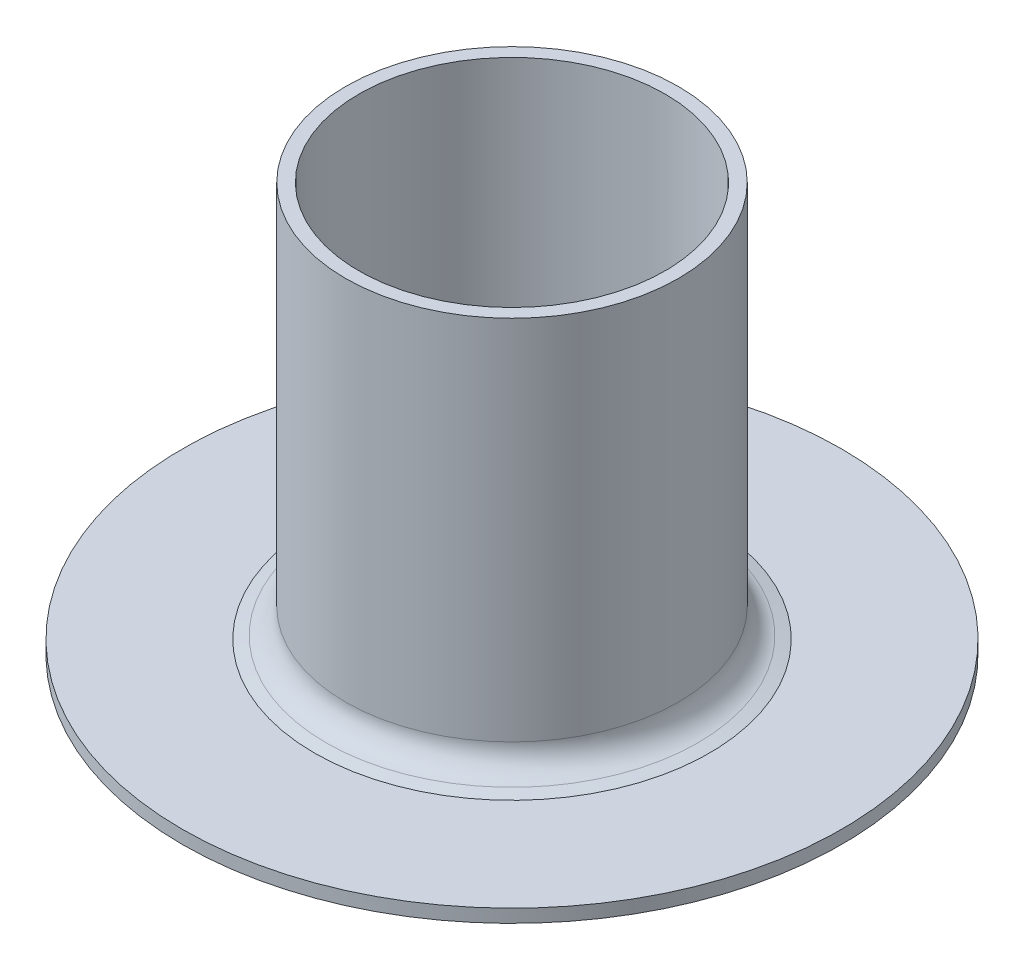
ISO-10303-21;
HEADER;
FILE_DESCRIPTION(('STEP AP214'),'2;1');
FILE_NAME('part.step','',(''),(''),'','','');
FILE_SCHEMA(('AUTOMOTIVE_DESIGN { 1 0 10303 214 1 1 1 1 }'));
ENDSEC;
DATA;
#1=APPLICATION_CONTEXT('core data for automotive mechanical design processes');
#2=APPLICATION_PROTOCOL_DEFINITION('international standard','automotive_design',2000,#1);
#3=PRODUCT_CONTEXT('',#1,'mechanical');
#4=PRODUCT('Part','Part','',(#3));
#5=PRODUCT_RELATED_PRODUCT_CATEGORY('part','',(#4));
#6=PRODUCT_DEFINITION_FORMATION('','',#4);
#7=PRODUCT_DEFINITION_CONTEXT('part definition',#1,'design');
#8=PRODUCT_DEFINITION('design','',#6,#7);
#9=PRODUCT_DEFINITION_SHAPE('','',#8);
#10=(LENGTH_UNIT() NAMED_UNIT(*) SI_UNIT(.MILLI.,.METRE.));
#11=(NAMED_UNIT(*) PLANE_ANGLE_UNIT() SI_UNIT($,.RADIAN.));
#12=(NAMED_UNIT(*) SI_UNIT($,.STERADIAN.) SOLID_ANGLE_UNIT());
#13=UNCERTAINTY_MEASURE_WITH_UNIT(LENGTH_MEASURE(1.E-05),#10,'distance_accuracy_value','');
#14=(GEOMETRIC_REPRESENTATION_CONTEXT(3) GLOBAL_UNCERTAINTY_ASSIGNED_CONTEXT((#13)) GLOBAL_UNIT_ASSIGNED_CONTEXT((#10,
#11,#12)) REPRESENTATION_CONTEXT('',''));
#15=CARTESIAN_POINT('',(0.,0.,0.));
#16=DIRECTION('',(0.,0.,1.));
#17=DIRECTION('',(1.,0.,0.));
#18=AXIS2_PLACEMENT_3D('',#15,#16,#17);
#19=CARTESIAN_POINT('',(29.5148,-2.54,0.));
#20=DIRECTION('',(0.,-1.,0.));
#21=DIRECTION('',(0.,0.,-1.));
#22=AXIS2_PLACEMENT_3D('',#19,#20,#21);
#23=PLANE('',#22);
#24=CARTESIAN_POINT('',(0.,-2.54,0.));
#25=DIRECTION('',(0.,-1.,0.));
#26=DIRECTION('',(0.,0.,-1.));
#27=AXIS2_PLACEMENT_3D('',#24,#25,#26);
#28=CIRCLE('',#27,63.5);
#29=CARTESIAN_POINT('',(0.,-2.54,-63.5));
#30=VERTEX_POINT('',#29);
#31=EDGE_CURVE('E10',#30,#30,#28,.T.);
#32=ORIENTED_EDGE('',*,*,#31,.T.);
#33=EDGE_LOOP('',(#32));
#34=FACE_BOUND('',#33,.T.);
#35=CARTESIAN_POINT('',(0.,-2.54,0.));
#36=DIRECTION('',(0.,-1.,0.));
#37=DIRECTION('',(0.,0.,-1.));
#38=AXIS2_PLACEMENT_3D('',#35,#36,#37);
#39=CIRCLE('',#38,29.5148);
#40=CARTESIAN_POINT('',(0.,-2.54,-29.5148));
#41=VERTEX_POINT('',#40);
#42=EDGE_CURVE('E76',#41,#41,#39,.T.);
#43=ORIENTED_EDGE('',*,*,#42,.F.);
#44=EDGE_LOOP('',(#43));
#45=FACE_BOUND('',#44,.T.);
#46=ADVANCED_FACE('F41',(#34,#45),#23,.T.);
#47=CARTESIAN_POINT('',(0.,0.,0.));
#48=DIRECTION('',(0.,-1.,0.));
#49=DIRECTION('',(0.,0.,-1.));
#50=AXIS2_PLACEMENT_3D('',#47,#48,#49);
#51=CYLINDRICAL_SURFACE('',#50,63.5);
#52=CARTESIAN_POINT('',(0.,0.,0.));
#53=DIRECTION('',(0.,-1.,0.));
#54=DIRECTION('',(0.,0.,-1.));
#55=AXIS2_PLACEMENT_3D('',#52,#53,#54);
#56=CIRCLE('',#55,63.5);
#57=CARTESIAN_POINT('',(0.,0.,-63.5));
#58=VERTEX_POINT('',#57);
#59=EDGE_CURVE('E48',#58,#58,#56,.T.);
#60=ORIENTED_EDGE('',*,*,#59,.T.);
#61=EDGE_LOOP('',(#60));
#62=FACE_BOUND('',#61,.T.);
#63=ORIENTED_EDGE('',*,*,#31,.F.);
#64=EDGE_LOOP('',(#63));
#65=FACE_BOUND('',#64,.T.);
#66=ADVANCED_FACE('F85',(#62,#65),#51,.T.);
#67=CARTESIAN_POINT('',(63.5,0.,0.));
#68=DIRECTION('',(0.,1.,0.));
#69=DIRECTION('',(0.,0.,1.));
#70=AXIS2_PLACEMENT_3D('',#67,#68,#69);
#71=PLANE('',#70);
#72=CARTESIAN_POINT('',(0.,0.,0.));
#73=DIRECTION('',(0.,-1.,0.));
#74=DIRECTION('',(0.,0.,-1.));
#75=AXIS2_PLACEMENT_3D('',#72,#73,#74);
#76=CIRCLE('',#75,38.0492);
#77=CARTESIAN_POINT('',(0.,0.,-38.0492));
#78=VERTEX_POINT('',#77);
#79=EDGE_CURVE('E53',#78,#78,#76,.T.);
#80=ORIENTED_EDGE('',*,*,#79,.T.);
#81=EDGE_LOOP('',(#80));
#82=FACE_BOUND('',#81,.T.);
#83=ORIENTED_EDGE('',*,*,#59,.F.);
#84=EDGE_LOOP('',(#83));
#85=FACE_BOUND('',#84,.T.);
#86=ADVANCED_FACE('F89',(#82,#85),#71,.T.);
#87=CARTESIAN_POINT('',(0.,0.,0.));
#88=DIRECTION('',(0.,-1.,0.));
#89=DIRECTION('',(0.,0.,-1.));
#90=AXIS2_PLACEMENT_3D('',#87,#88,#89);
#91=CONICAL_SURFACE('',#90,38.0492,1.30899693899576);
#92=CARTESIAN_POINT('',(0.,0.597312540493741,0.));
#93=DIRECTION('',(0.,-1.,0.));
#94=DIRECTION('',(0.,0.,-1.));
#95=AXIS2_PLACEMENT_3D('',#92,#93,#94);
#96=CIRCLE('',#95,35.8199992508792);
#97=CARTESIAN_POINT('',(0.,0.597312540493741,-35.8199992508792));
#98=VERTEX_POINT('',#97);
#99=EDGE_CURVE('E58',#98,#98,#96,.T.);
#100=ORIENTED_EDGE('',*,*,#99,.T.);
#101=EDGE_LOOP('',(#100));
#102=FACE_BOUND('',#101,.T.);
#103=ORIENTED_EDGE('',*,*,#79,.F.);
#104=EDGE_LOOP('',(#103));
#105=FACE_BOUND('',#104,.T.);
#106=ADVANCED_FACE('F93',(#102,#105),#91,.T.);
#107=CARTESIAN_POINT('',(0.,5.50421573804222,0.));
#108=DIRECTION('',(0.,-1.,0.));
#109=DIRECTION('',(0.,0.,-1.));
#110=AXIS2_PLACEMENT_3D('',#107,#108,#109);
#111=TOROIDAL_SURFACE('',#110,37.1348,5.08);
#112=CARTESIAN_POINT('',(0.,5.50421573804222,0.));
#113=DIRECTION('',(0.,-1.,0.));
#114=DIRECTION('',(0.,0.,-1.));
#115=AXIS2_PLACEMENT_3D('',#112,#113,#114);
#116=CIRCLE('',#115,32.0548);
#117=CARTESIAN_POINT('',(0.,5.50421573804222,-32.0548));
#118=VERTEX_POINT('',#117);
#119=EDGE_CURVE('E64',#118,#118,#116,.T.);
#120=ORIENTED_EDGE('',*,*,#119,.T.);
#121=EDGE_LOOP('',(#120));
#122=FACE_BOUND('',#121,.T.);
#123=ORIENTED_EDGE('',*,*,#99,.F.);
#124=EDGE_LOOP('',(#123));
#125=FACE_BOUND('',#124,.T.);
#126=ADVANCED_FACE('F100',(#122,#125),#111,.F.);
#127=CARTESIAN_POINT('',(0.,0.,0.));
#128=DIRECTION('',(0.,-1.,0.));
#129=DIRECTION('',(0.,0.,-1.));
#130=AXIS2_PLACEMENT_3D('',#127,#128,#129);
#131=CYLINDRICAL_SURFACE('',#130,32.0548);
#132=CARTESIAN_POINT('',(0.,76.2,0.));
#133=DIRECTION('',(0.,-1.,0.));
#134=DIRECTION('',(0.,0.,-1.));
#135=AXIS2_PLACEMENT_3D('',#132,#133,#134);
#136=CIRCLE('',#135,32.0548);
#137=CARTESIAN_POINT('',(0.,76.2,-32.0548));
#138=VERTEX_POINT('',#137);
#139=EDGE_CURVE('E68',#138,#138,#136,.T.);
#140=ORIENTED_EDGE('',*,*,#139,.T.);
#141=EDGE_LOOP('',(#140));
#142=FACE_BOUND('',#141,.T.);
#143=ORIENTED_EDGE('',*,*,#119,.F.);
#144=EDGE_LOOP('',(#143));
#145=FACE_BOUND('',#144,.T.);
#146=ADVANCED_FACE('F104',(#142,#145),#131,.T.);
#147=CARTESIAN_POINT('',(29.5148,76.2,0.));
#148=DIRECTION('',(0.,1.,0.));
#149=DIRECTION('',(0.,0.,1.));
#150=AXIS2_PLACEMENT_3D('',#147,#148,#149);
#151=PLANE('',#150);
#152=CARTESIAN_POINT('',(0.,76.2,0.));
#153=DIRECTION('',(0.,-1.,0.));
#154=DIRECTION('',(0.,0.,-1.));
#155=AXIS2_PLACEMENT_3D('',#152,#153,#154);
#156=CIRCLE('',#155,29.5148);
#157=CARTESIAN_POINT('',(0.,76.2,-29.5148));
#158=VERTEX_POINT('',#157);
#159=EDGE_CURVE('E72',#158,#158,#156,.T.);
#160=ORIENTED_EDGE('',*,*,#159,.T.);
#161=EDGE_LOOP('',(#160));
#162=FACE_BOUND('',#161,.T.);
#163=ORIENTED_EDGE('',*,*,#139,.F.);
#164=EDGE_LOOP('',(#163));
#165=FACE_BOUND('',#164,.T.);
#166=ADVANCED_FACE('F108',(#162,#165),#151,.T.);
#167=CARTESIAN_POINT('',(0.,0.,0.));
#168=DIRECTION('',(0.,-1.,0.));
#169=DIRECTION('',(0.,0.,-1.));
#170=AXIS2_PLACEMENT_3D('',#167,#168,#169);
#171=CYLINDRICAL_SURFACE('',#170,29.5148);
#172=ORIENTED_EDGE('',*,*,#42,.T.);
#173=EDGE_LOOP('',(#172));
#174=FACE_BOUND('',#173,.T.);
#175=ORIENTED_EDGE('',*,*,#159,.F.);
#176=EDGE_LOOP('',(#175));
#177=FACE_BOUND('',#176,.T.);
#178=ADVANCED_FACE('F81',(#174,#177),#171,.F.);
#179=CLOSED_SHELL('',(#46,#66,#86,#106,#126,#146,#166,#178));
#180=MANIFOLD_SOLID_BREP('B2',#179);
#181=ADVANCED_BREP_SHAPE_REPRESENTATION('',(#18,#180),#14);
#182=SHAPE_DEFINITION_REPRESENTATION(#9,#181);
ENDSEC;
END-ISO-10303-21;
